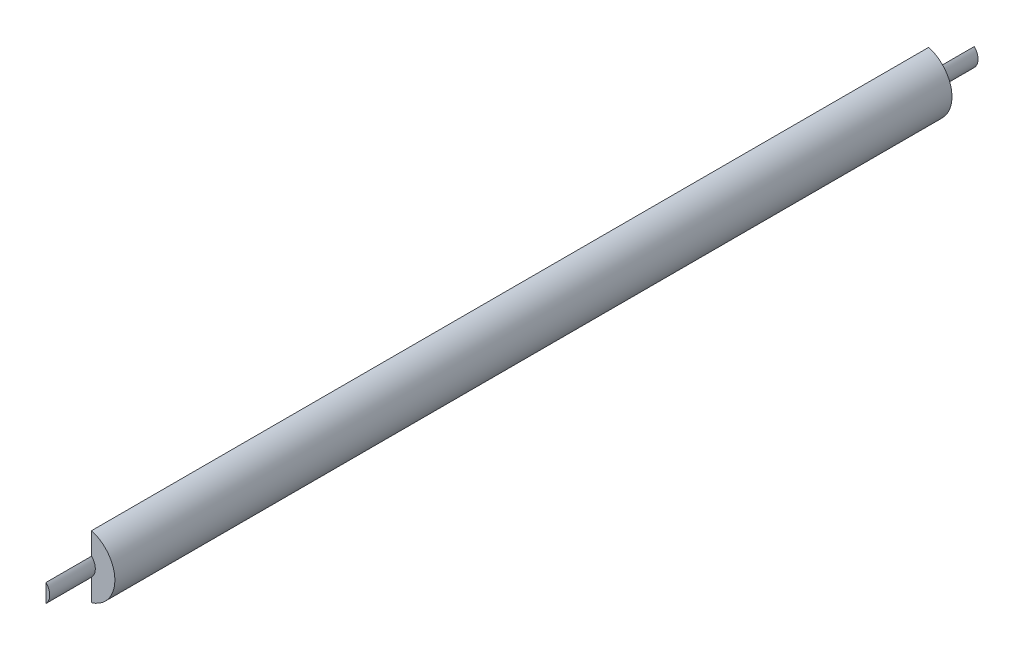
ISO-10303-21;
HEADER;
FILE_DESCRIPTION(('STEP AP214'),'2;1');
FILE_NAME('part.step','',(''),(''),'','','');
FILE_SCHEMA(('AUTOMOTIVE_DESIGN { 1 0 10303 214 1 1 1 1 }'));
ENDSEC;
DATA;
#1=APPLICATION_CONTEXT('core data for automotive mechanical design processes');
#2=APPLICATION_PROTOCOL_DEFINITION('international standard','automotive_design',2000,#1);
#3=PRODUCT_CONTEXT('',#1,'mechanical');
#4=PRODUCT('Part','Part','',(#3));
#5=PRODUCT_RELATED_PRODUCT_CATEGORY('part','',(#4));
#6=PRODUCT_DEFINITION_FORMATION('','',#4);
#7=PRODUCT_DEFINITION_CONTEXT('part definition',#1,'design');
#8=PRODUCT_DEFINITION('design','',#6,#7);
#9=PRODUCT_DEFINITION_SHAPE('','',#8);
#10=(LENGTH_UNIT() NAMED_UNIT(*) SI_UNIT(.MILLI.,.METRE.));
#11=(NAMED_UNIT(*) PLANE_ANGLE_UNIT() SI_UNIT($,.RADIAN.));
#12=(NAMED_UNIT(*) SI_UNIT($,.STERADIAN.) SOLID_ANGLE_UNIT());
#13=UNCERTAINTY_MEASURE_WITH_UNIT(LENGTH_MEASURE(1.E-05),#10,'distance_accuracy_value','');
#14=(GEOMETRIC_REPRESENTATION_CONTEXT(3) GLOBAL_UNCERTAINTY_ASSIGNED_CONTEXT((#13)) GLOBAL_UNIT_ASSIGNED_CONTEXT((#10,
#11,#12)) REPRESENTATION_CONTEXT('',''));
#15=CARTESIAN_POINT('',(0.,0.,0.));
#16=DIRECTION('',(0.,0.,1.));
#17=DIRECTION('',(1.,0.,0.));
#18=AXIS2_PLACEMENT_3D('',#15,#16,#17);
#19=CARTESIAN_POINT('',(0.,0.,-4.9));
#20=DIRECTION('',(0.,0.,-1.));
#21=DIRECTION('',(-1.,0.,0.));
#22=AXIS2_PLACEMENT_3D('',#19,#20,#21);
#23=PLANE('',#22);
#24=DIRECTION('',(0.,-1.,0.));
#25=VECTOR('',#24,1.);
#26=CARTESIAN_POINT('',(1.,0.,-4.9));
#27=LINE('',#26,#25);
#28=CARTESIAN_POINT('',(1.,0.979795897113271,-4.9));
#29=VERTEX_POINT('',#28);
#30=CARTESIAN_POINT('',(1.,-0.97979589711327,-4.9));
#31=VERTEX_POINT('',#30);
#32=EDGE_CURVE('E11',#29,#31,#27,.T.);
#33=ORIENTED_EDGE('',*,*,#32,.F.);
#34=CARTESIAN_POINT('',(0.,0.,-4.9));
#35=DIRECTION('',(0.,0.,-1.));
#36=DIRECTION('',(-1.,0.,0.));
#37=AXIS2_PLACEMENT_3D('',#34,#35,#36);
#38=CIRCLE('',#37,1.4);
#39=EDGE_CURVE('E100',#29,#31,#38,.T.);
#40=ORIENTED_EDGE('',*,*,#39,.T.);
#41=EDGE_LOOP('',(#33,#40));
#42=FACE_BOUND('',#41,.T.);
#43=ADVANCED_FACE('F32',(#42),#23,.T.);
#44=CARTESIAN_POINT('',(0.,0.,-4.9));
#45=DIRECTION('',(0.,0.,1.));
#46=DIRECTION('',(1.,0.,0.));
#47=AXIS2_PLACEMENT_3D('',#44,#45,#46);
#48=CYLINDRICAL_SURFACE('',#47,1.4);
#49=ORIENTED_EDGE('',*,*,#39,.F.);
#50=DIRECTION('',(0.,0.,1.));
#51=VECTOR('',#50,1.);
#52=CARTESIAN_POINT('',(1.,0.979795897113271,-4.9));
#53=LINE('',#52,#51);
#54=CARTESIAN_POINT('',(1.,0.979795897113271,0.));
#55=VERTEX_POINT('',#54);
#56=EDGE_CURVE('E46',#29,#55,#53,.T.);
#57=ORIENTED_EDGE('',*,*,#56,.T.);
#58=CARTESIAN_POINT('',(0.,0.,0.));
#59=DIRECTION('',(0.,0.,-1.));
#60=DIRECTION('',(-1.,0.,0.));
#61=AXIS2_PLACEMENT_3D('',#58,#59,#60);
#62=CIRCLE('',#61,1.4);
#63=CARTESIAN_POINT('',(1.,-0.979795897113271,0.));
#64=VERTEX_POINT('',#63);
#65=EDGE_CURVE('E40',#55,#64,#62,.T.);
#66=ORIENTED_EDGE('',*,*,#65,.T.);
#67=DIRECTION('',(0.,0.,1.));
#68=VECTOR('',#67,1.);
#69=CARTESIAN_POINT('',(1.,-0.979795897113271,-4.9));
#70=LINE('',#69,#68);
#71=EDGE_CURVE('E96',#64,#31,#70,.F.);
#72=ORIENTED_EDGE('',*,*,#71,.T.);
#73=EDGE_LOOP('',(#49,#57,#66,#72));
#74=FACE_BOUND('',#73,.T.);
#75=ADVANCED_FACE('F136',(#74),#48,.T.);
#76=CARTESIAN_POINT('',(0.,0.,0.));
#77=DIRECTION('',(0.,0.,1.));
#78=DIRECTION('',(1.,0.,0.));
#79=AXIS2_PLACEMENT_3D('',#76,#77,#78);
#80=PLANE('',#79);
#81=CARTESIAN_POINT('',(0.,0.,0.));
#82=DIRECTION('',(0.,0.,1.));
#83=DIRECTION('',(1.,0.,0.));
#84=AXIS2_PLACEMENT_3D('',#81,#82,#83);
#85=CIRCLE('',#84,3.5);
#86=CARTESIAN_POINT('',(1.,-3.35410196624968,0.));
#87=VERTEX_POINT('',#86);
#88=CARTESIAN_POINT('',(1.,3.35410196624968,0.));
#89=VERTEX_POINT('',#88);
#90=EDGE_CURVE('E99',#87,#89,#85,.T.);
#91=ORIENTED_EDGE('',*,*,#90,.F.);
#92=DIRECTION('',(0.,1.,0.));
#93=VECTOR('',#92,1.);
#94=CARTESIAN_POINT('',(1.,0.,0.));
#95=LINE('',#94,#93);
#96=EDGE_CURVE('E126',#87,#64,#95,.T.);
#97=ORIENTED_EDGE('',*,*,#96,.T.);
#98=ORIENTED_EDGE('',*,*,#65,.F.);
#99=EDGE_CURVE('E122',#55,#89,#95,.T.);
#100=ORIENTED_EDGE('',*,*,#99,.T.);
#101=EDGE_LOOP('',(#91,#97,#98,#100));
#102=FACE_BOUND('',#101,.T.);
#103=ADVANCED_FACE('F144',(#102),#80,.F.);
#104=CARTESIAN_POINT('',(0.,0.,94.9));
#105=DIRECTION('',(0.,0.,1.));
#106=DIRECTION('',(1.,0.,0.));
#107=AXIS2_PLACEMENT_3D('',#104,#105,#106);
#108=PLANE('',#107);
#109=DIRECTION('',(0.,1.,0.));
#110=VECTOR('',#109,1.);
#111=CARTESIAN_POINT('',(1.,3.86835614548139,94.9));
#112=LINE('',#111,#110);
#113=CARTESIAN_POINT('',(1.,-0.97979589711327,94.9));
#114=VERTEX_POINT('',#113);
#115=CARTESIAN_POINT('',(1.,0.979795897113271,94.9));
#116=VERTEX_POINT('',#115);
#117=EDGE_CURVE('E84',#114,#116,#112,.T.);
#118=ORIENTED_EDGE('',*,*,#117,.F.);
#119=CARTESIAN_POINT('',(0.,0.,94.9));
#120=DIRECTION('',(0.,0.,1.));
#121=DIRECTION('',(1.,0.,0.));
#122=AXIS2_PLACEMENT_3D('',#119,#120,#121);
#123=CIRCLE('',#122,1.4);
#124=EDGE_CURVE('E95',#114,#116,#123,.T.);
#125=ORIENTED_EDGE('',*,*,#124,.T.);
#126=EDGE_LOOP('',(#118,#125));
#127=FACE_BOUND('',#126,.T.);
#128=ADVANCED_FACE('F94',(#127),#108,.T.);
#129=CARTESIAN_POINT('',(0.,0.,94.9));
#130=DIRECTION('',(0.,0.,-1.));
#131=DIRECTION('',(-1.,0.,0.));
#132=AXIS2_PLACEMENT_3D('',#129,#130,#131);
#133=CYLINDRICAL_SURFACE('',#132,1.4);
#134=ORIENTED_EDGE('',*,*,#124,.F.);
#135=DIRECTION('',(0.,0.,-1.));
#136=VECTOR('',#135,1.);
#137=CARTESIAN_POINT('',(1.,-0.979795897113271,94.9));
#138=LINE('',#137,#136);
#139=CARTESIAN_POINT('',(1.,-0.979795897113271,90.));
#140=VERTEX_POINT('',#139);
#141=EDGE_CURVE('E81',#114,#140,#138,.T.);
#142=ORIENTED_EDGE('',*,*,#141,.T.);
#143=CARTESIAN_POINT('',(0.,0.,90.));
#144=DIRECTION('',(0.,0.,1.));
#145=DIRECTION('',(1.,0.,0.));
#146=AXIS2_PLACEMENT_3D('',#143,#144,#145);
#147=CIRCLE('',#146,1.4);
#148=CARTESIAN_POINT('',(1.,0.979795897113271,90.));
#149=VERTEX_POINT('',#148);
#150=EDGE_CURVE('E108',#140,#149,#147,.T.);
#151=ORIENTED_EDGE('',*,*,#150,.T.);
#152=DIRECTION('',(0.,0.,-1.));
#153=VECTOR('',#152,1.);
#154=CARTESIAN_POINT('',(1.,0.979795897113271,94.9));
#155=LINE('',#154,#153);
#156=EDGE_CURVE('E53',#149,#116,#155,.F.);
#157=ORIENTED_EDGE('',*,*,#156,.T.);
#158=EDGE_LOOP('',(#134,#142,#151,#157));
#159=FACE_BOUND('',#158,.T.);
#160=ADVANCED_FACE('F98',(#159),#133,.T.);
#161=CARTESIAN_POINT('',(0.,0.,90.));
#162=DIRECTION('',(0.,0.,1.));
#163=DIRECTION('',(1.,0.,0.));
#164=AXIS2_PLACEMENT_3D('',#161,#162,#163);
#165=PLANE('',#164);
#166=DIRECTION('',(0.,1.,0.));
#167=VECTOR('',#166,1.);
#168=CARTESIAN_POINT('',(1.,0.,90.));
#169=LINE('',#168,#167);
#170=CARTESIAN_POINT('',(1.,-3.35410196624968,90.));
#171=VERTEX_POINT('',#170);
#172=EDGE_CURVE('E86',#171,#140,#169,.T.);
#173=ORIENTED_EDGE('',*,*,#172,.F.);
#174=CARTESIAN_POINT('',(0.,0.,90.));
#175=DIRECTION('',(0.,0.,1.));
#176=DIRECTION('',(1.,0.,0.));
#177=AXIS2_PLACEMENT_3D('',#174,#175,#176);
#178=CIRCLE('',#177,3.5);
#179=CARTESIAN_POINT('',(1.,3.35410196624968,90.));
#180=VERTEX_POINT('',#179);
#181=EDGE_CURVE('E103',#171,#180,#178,.T.);
#182=ORIENTED_EDGE('',*,*,#181,.T.);
#183=EDGE_CURVE('E114',#149,#180,#169,.T.);
#184=ORIENTED_EDGE('',*,*,#183,.F.);
#185=ORIENTED_EDGE('',*,*,#150,.F.);
#186=EDGE_LOOP('',(#173,#182,#184,#185));
#187=FACE_BOUND('',#186,.T.);
#188=ADVANCED_FACE('F113',(#187),#165,.T.);
#189=CARTESIAN_POINT('',(0.,0.,90.));
#190=DIRECTION('',(0.,0.,-1.));
#191=DIRECTION('',(-1.,0.,0.));
#192=AXIS2_PLACEMENT_3D('',#189,#190,#191);
#193=CYLINDRICAL_SURFACE('',#192,3.5);
#194=ORIENTED_EDGE('',*,*,#181,.F.);
#195=DIRECTION('',(0.,0.,-1.));
#196=VECTOR('',#195,1.);
#197=CARTESIAN_POINT('',(1.,-3.35410196624968,90.));
#198=LINE('',#197,#196);
#199=EDGE_CURVE('E118',#171,#87,#198,.T.);
#200=ORIENTED_EDGE('',*,*,#199,.T.);
#201=ORIENTED_EDGE('',*,*,#90,.T.);
#202=DIRECTION('',(0.,0.,-1.));
#203=VECTOR('',#202,1.);
#204=CARTESIAN_POINT('',(1.,3.35410196624968,90.));
#205=LINE('',#204,#203);
#206=EDGE_CURVE('E120',#89,#180,#205,.F.);
#207=ORIENTED_EDGE('',*,*,#206,.T.);
#208=EDGE_LOOP('',(#194,#200,#201,#207));
#209=FACE_BOUND('',#208,.T.);
#210=ADVANCED_FACE('F34',(#209),#193,.T.);
#211=CARTESIAN_POINT('',(1.,3.86835614548139,-4.9));
#212=DIRECTION('',(1.,0.,0.));
#213=DIRECTION('',(0.,1.,0.));
#214=AXIS2_PLACEMENT_3D('',#211,#212,#213);
#215=PLANE('',#214);
#216=ORIENTED_EDGE('',*,*,#183,.T.);
#217=ORIENTED_EDGE('',*,*,#206,.F.);
#218=ORIENTED_EDGE('',*,*,#99,.F.);
#219=ORIENTED_EDGE('',*,*,#56,.F.);
#220=ORIENTED_EDGE('',*,*,#32,.T.);
#221=ORIENTED_EDGE('',*,*,#71,.F.);
#222=ORIENTED_EDGE('',*,*,#96,.F.);
#223=ORIENTED_EDGE('',*,*,#199,.F.);
#224=ORIENTED_EDGE('',*,*,#172,.T.);
#225=ORIENTED_EDGE('',*,*,#141,.F.);
#226=ORIENTED_EDGE('',*,*,#117,.T.);
#227=ORIENTED_EDGE('',*,*,#156,.F.);
#228=EDGE_LOOP('',(#216,#217,#218,#219,#220,#221,#222,#223,#224,#225,#226,#227));
#229=FACE_BOUND('',#228,.T.);
#230=ADVANCED_FACE('F83',(#229),#215,.F.);
#231=CLOSED_SHELL('',(#43,#75,#103,#128,#160,#188,#210,#230));
#232=MANIFOLD_SOLID_BREP('B2',#231);
#233=ADVANCED_BREP_SHAPE_REPRESENTATION('',(#18,#232),#14);
#234=SHAPE_DEFINITION_REPRESENTATION(#9,#233);
ENDSEC;
END-ISO-10303-21;
